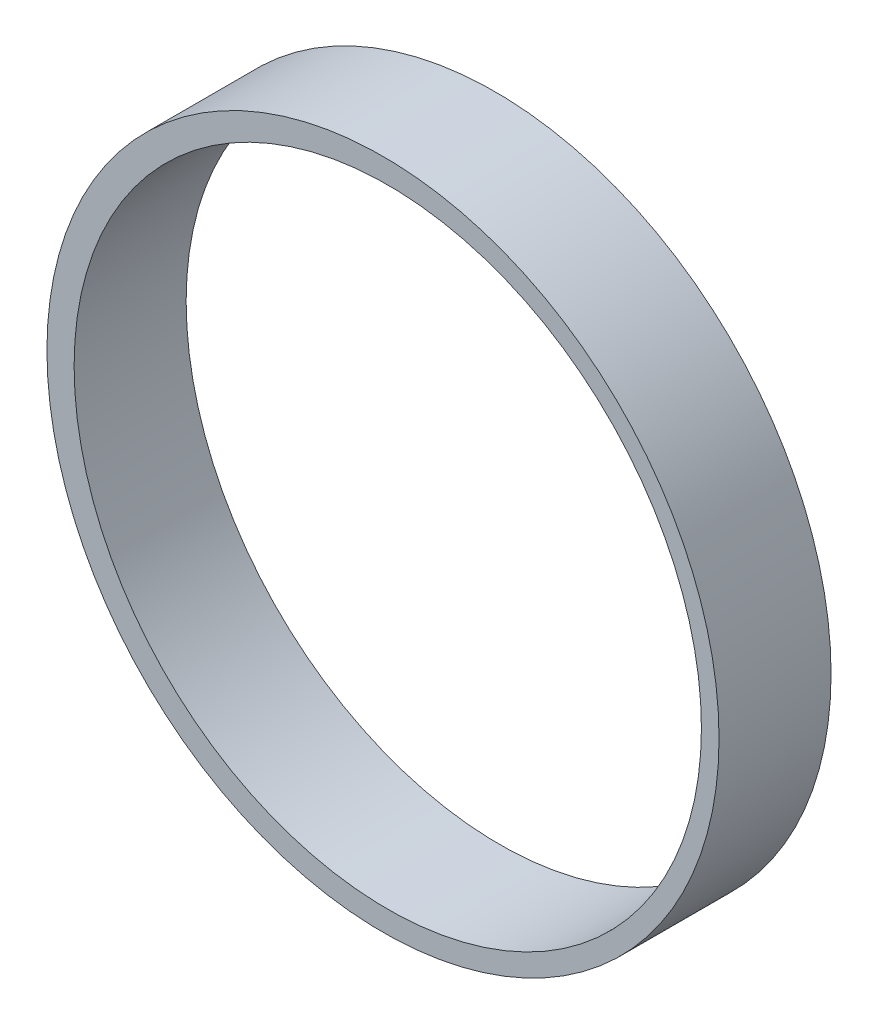
ISO-10303-21;
HEADER;
FILE_DESCRIPTION(('STEP AP214'),'2;1');
FILE_NAME('part.step','',(''),(''),'','','');
FILE_SCHEMA(('AUTOMOTIVE_DESIGN { 1 0 10303 214 1 1 1 1 }'));
ENDSEC;
DATA;
#1=APPLICATION_CONTEXT('core data for automotive mechanical design processes');
#2=APPLICATION_PROTOCOL_DEFINITION('international standard','automotive_design',2000,#1);
#3=PRODUCT_CONTEXT('',#1,'mechanical');
#4=PRODUCT('Part','Part','',(#3));
#5=PRODUCT_RELATED_PRODUCT_CATEGORY('part','',(#4));
#6=PRODUCT_DEFINITION_FORMATION('','',#4);
#7=PRODUCT_DEFINITION_CONTEXT('part definition',#1,'design');
#8=PRODUCT_DEFINITION('design','',#6,#7);
#9=PRODUCT_DEFINITION_SHAPE('','',#8);
#10=(LENGTH_UNIT() NAMED_UNIT(*) SI_UNIT(.MILLI.,.METRE.));
#11=(NAMED_UNIT(*) PLANE_ANGLE_UNIT() SI_UNIT($,.RADIAN.));
#12=(NAMED_UNIT(*) SI_UNIT($,.STERADIAN.) SOLID_ANGLE_UNIT());
#13=UNCERTAINTY_MEASURE_WITH_UNIT(LENGTH_MEASURE(1.E-05),#10,'distance_accuracy_value','');
#14=(GEOMETRIC_REPRESENTATION_CONTEXT(3) GLOBAL_UNCERTAINTY_ASSIGNED_CONTEXT((#13)) GLOBAL_UNIT_ASSIGNED_CONTEXT((#10,
#11,#12)) REPRESENTATION_CONTEXT('',''));
#15=CARTESIAN_POINT('',(0.,0.,0.));
#16=DIRECTION('',(0.,0.,1.));
#17=DIRECTION('',(1.,0.,0.));
#18=AXIS2_PLACEMENT_3D('',#15,#16,#17);
#19=CARTESIAN_POINT('',(0.,0.,5.));
#20=DIRECTION('',(0.,0.,-1.));
#21=DIRECTION('',(-1.,0.,0.));
#22=AXIS2_PLACEMENT_3D('',#19,#20,#21);
#23=CYLINDRICAL_SURFACE('',#22,15.);
#24=CARTESIAN_POINT('',(0.,0.,5.));
#25=DIRECTION('',(0.,0.,1.));
#26=DIRECTION('',(1.,0.,0.));
#27=AXIS2_PLACEMENT_3D('',#24,#25,#26);
#28=CIRCLE('',#27,15.);
#29=CARTESIAN_POINT('',(15.,0.,5.));
#30=VERTEX_POINT('',#29);
#31=EDGE_CURVE('E10',#30,#30,#28,.T.);
#32=ORIENTED_EDGE('',*,*,#31,.F.);
#33=EDGE_LOOP('',(#32));
#34=FACE_BOUND('',#33,.T.);
#35=CARTESIAN_POINT('',(0.,0.,0.));
#36=DIRECTION('',(0.,0.,1.));
#37=DIRECTION('',(1.,0.,0.));
#38=AXIS2_PLACEMENT_3D('',#35,#36,#37);
#39=CIRCLE('',#38,15.);
#40=CARTESIAN_POINT('',(15.,0.,0.));
#41=VERTEX_POINT('',#40);
#42=EDGE_CURVE('E40',#41,#41,#39,.T.);
#43=ORIENTED_EDGE('',*,*,#42,.T.);
#44=EDGE_LOOP('',(#43));
#45=FACE_BOUND('',#44,.T.);
#46=ADVANCED_FACE('F37',(#34,#45),#23,.T.);
#47=CARTESIAN_POINT('',(0.,0.,5.));
#48=DIRECTION('',(0.,0.,1.));
#49=DIRECTION('',(1.,0.,0.));
#50=AXIS2_PLACEMENT_3D('',#47,#48,#49);
#51=PLANE('',#50);
#52=CARTESIAN_POINT('',(0.213293684317238,0.,5.));
#53=DIRECTION('',(0.,0.,1.));
#54=DIRECTION('',(1.,0.,0.));
#55=AXIS2_PLACEMENT_3D('',#52,#53,#54);
#56=CIRCLE('',#55,14.);
#57=CARTESIAN_POINT('',(14.2132936843172,0.,5.));
#58=VERTEX_POINT('',#57);
#59=EDGE_CURVE('E51',#58,#58,#56,.T.);
#60=ORIENTED_EDGE('',*,*,#59,.F.);
#61=EDGE_LOOP('',(#60));
#62=FACE_BOUND('',#61,.T.);
#63=ORIENTED_EDGE('',*,*,#31,.T.);
#64=EDGE_LOOP('',(#63));
#65=FACE_BOUND('',#64,.T.);
#66=ADVANCED_FACE('F68',(#62,#65),#51,.T.);
#67=CARTESIAN_POINT('',(0.,0.,0.));
#68=DIRECTION('',(0.,0.,1.));
#69=DIRECTION('',(1.,0.,0.));
#70=AXIS2_PLACEMENT_3D('',#67,#68,#69);
#71=PLANE('',#70);
#72=CARTESIAN_POINT('',(0.213293684317238,0.,0.));
#73=DIRECTION('',(0.,0.,1.));
#74=DIRECTION('',(1.,0.,0.));
#75=AXIS2_PLACEMENT_3D('',#72,#73,#74);
#76=CIRCLE('',#75,14.);
#77=CARTESIAN_POINT('',(14.2132936843172,0.,0.));
#78=VERTEX_POINT('',#77);
#79=EDGE_CURVE('E49',#78,#78,#76,.T.);
#80=ORIENTED_EDGE('',*,*,#79,.T.);
#81=EDGE_LOOP('',(#80));
#82=FACE_BOUND('',#81,.T.);
#83=ORIENTED_EDGE('',*,*,#42,.F.);
#84=EDGE_LOOP('',(#83));
#85=FACE_BOUND('',#84,.T.);
#86=ADVANCED_FACE('F59',(#82,#85),#71,.F.);
#87=CARTESIAN_POINT('',(0.213293684317238,0.,0.));
#88=DIRECTION('',(0.,0.,1.));
#89=DIRECTION('',(1.,0.,0.));
#90=AXIS2_PLACEMENT_3D('',#87,#88,#89);
#91=CYLINDRICAL_SURFACE('',#90,14.);
#92=ORIENTED_EDGE('',*,*,#79,.F.);
#93=EDGE_LOOP('',(#92));
#94=FACE_BOUND('',#93,.T.);
#95=ORIENTED_EDGE('',*,*,#59,.T.);
#96=EDGE_LOOP('',(#95));
#97=FACE_BOUND('',#96,.T.);
#98=ADVANCED_FACE('F62',(#94,#97),#91,.F.);
#99=CLOSED_SHELL('',(#46,#66,#86,#98));
#100=MANIFOLD_SOLID_BREP('B2',#99);
#101=ADVANCED_BREP_SHAPE_REPRESENTATION('',(#18,#100),#14);
#102=SHAPE_DEFINITION_REPRESENTATION(#9,#101);
ENDSEC;
END-ISO-10303-21;
